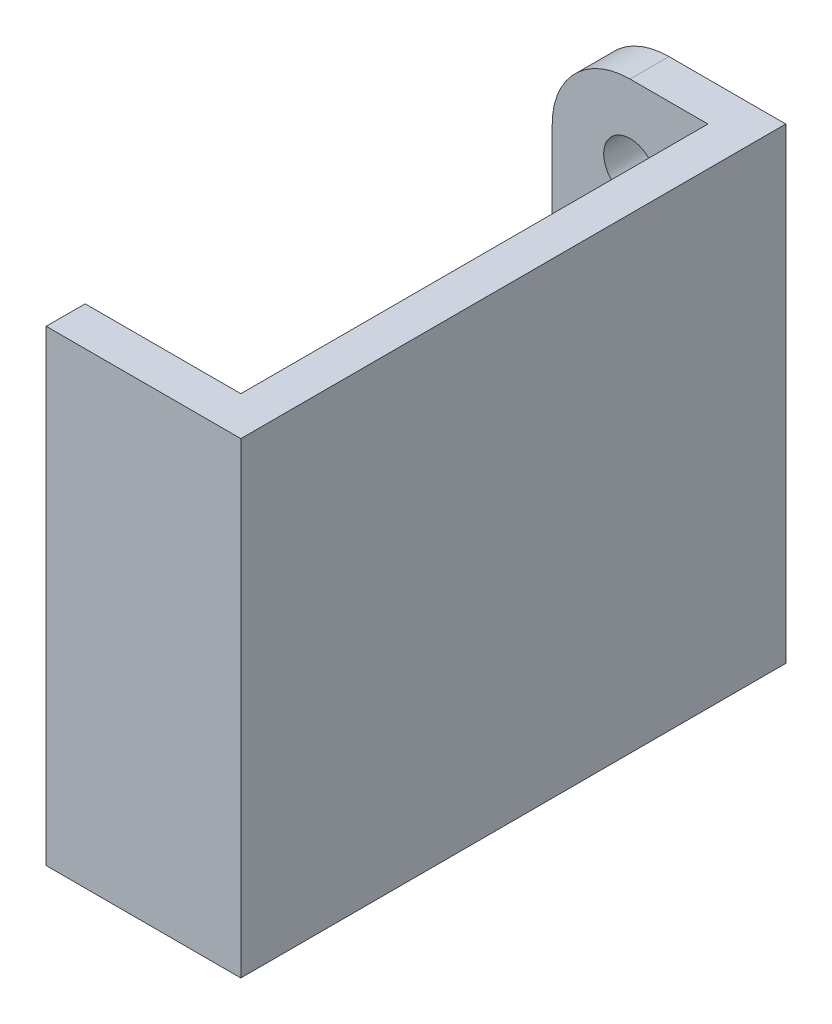
ISO-10303-21;
HEADER;
FILE_DESCRIPTION(('STEP AP214'),'2;1');
FILE_NAME('part.step','',(''),(''),'','','');
FILE_SCHEMA(('AUTOMOTIVE_DESIGN { 1 0 10303 214 1 1 1 1 }'));
ENDSEC;
DATA;
#1=APPLICATION_CONTEXT('core data for automotive mechanical design processes');
#2=APPLICATION_PROTOCOL_DEFINITION('international standard','automotive_design',2000,#1);
#3=PRODUCT_CONTEXT('',#1,'mechanical');
#4=PRODUCT('Part','Part','',(#3));
#5=PRODUCT_RELATED_PRODUCT_CATEGORY('part','',(#4));
#6=PRODUCT_DEFINITION_FORMATION('','',#4);
#7=PRODUCT_DEFINITION_CONTEXT('part definition',#1,'design');
#8=PRODUCT_DEFINITION('design','',#6,#7);
#9=PRODUCT_DEFINITION_SHAPE('','',#8);
#10=(LENGTH_UNIT() NAMED_UNIT(*) SI_UNIT(.MILLI.,.METRE.));
#11=(NAMED_UNIT(*) PLANE_ANGLE_UNIT() SI_UNIT($,.RADIAN.));
#12=(NAMED_UNIT(*) SI_UNIT($,.STERADIAN.) SOLID_ANGLE_UNIT());
#13=UNCERTAINTY_MEASURE_WITH_UNIT(LENGTH_MEASURE(1.E-05),#10,'distance_accuracy_value','');
#14=(GEOMETRIC_REPRESENTATION_CONTEXT(3) GLOBAL_UNCERTAINTY_ASSIGNED_CONTEXT((#13)) GLOBAL_UNIT_ASSIGNED_CONTEXT((#10,
#11,#12)) REPRESENTATION_CONTEXT('',''));
#15=CARTESIAN_POINT('',(0.,0.,0.));
#16=DIRECTION('',(0.,0.,1.));
#17=DIRECTION('',(1.,0.,0.));
#18=AXIS2_PLACEMENT_3D('',#15,#16,#17);
#19=CARTESIAN_POINT('',(-7.9375,19.05,-44.45));
#20=DIRECTION('',(-1.,0.,0.));
#21=DIRECTION('',(0.,-1.,0.));
#22=AXIS2_PLACEMENT_3D('',#19,#20,#21);
#23=PLANE('',#22);
#24=DIRECTION('',(0.,-1.,0.));
#25=VECTOR('',#24,1.);
#26=CARTESIAN_POINT('',(-7.9375,0.,-41.275));
#27=LINE('',#26,#25);
#28=CARTESIAN_POINT('',(-7.9375,12.7,-41.275));
#29=VERTEX_POINT('',#28);
#30=CARTESIAN_POINT('',(-7.9375,-15.875,-41.275));
#31=VERTEX_POINT('',#30);
#32=EDGE_CURVE('E138',#29,#31,#27,.T.);
#33=ORIENTED_EDGE('',*,*,#32,.F.);
#34=DIRECTION('',(0.,0.,1.));
#35=VECTOR('',#34,1.);
#36=CARTESIAN_POINT('',(-7.9375,12.7,-44.45));
#37=LINE('',#36,#35);
#38=CARTESIAN_POINT('',(-7.9375,12.7,-44.45));
#39=VERTEX_POINT('',#38);
#40=EDGE_CURVE('E52',#29,#39,#37,.F.);
#41=ORIENTED_EDGE('',*,*,#40,.T.);
#42=DIRECTION('',(0.,-1.,0.));
#43=VECTOR('',#42,1.);
#44=CARTESIAN_POINT('',(-7.9375,19.05,-44.45));
#45=LINE('',#44,#43);
#46=CARTESIAN_POINT('',(-7.9375,-19.05,-44.45));
#47=VERTEX_POINT('',#46);
#48=EDGE_CURVE('E169',#39,#47,#45,.T.);
#49=ORIENTED_EDGE('',*,*,#48,.T.);
#50=DIRECTION('',(0.,0.,1.));
#51=VECTOR('',#50,1.);
#52=CARTESIAN_POINT('',(-7.9375,-19.05,-44.45));
#53=LINE('',#52,#51);
#54=CARTESIAN_POINT('',(-7.9375,-19.05,0.));
#55=VERTEX_POINT('',#54);
#56=EDGE_CURVE('E195',#47,#55,#53,.T.);
#57=ORIENTED_EDGE('',*,*,#56,.T.);
#58=DIRECTION('',(0.,-1.,0.));
#59=VECTOR('',#58,1.);
#60=CARTESIAN_POINT('',(-7.9375,19.05,0.));
#61=LINE('',#60,#59);
#62=CARTESIAN_POINT('',(-7.9375,19.05,0.));
#63=VERTEX_POINT('',#62);
#64=EDGE_CURVE('E184',#63,#55,#61,.T.);
#65=ORIENTED_EDGE('',*,*,#64,.F.);
#66=DIRECTION('',(0.,0.,1.));
#67=VECTOR('',#66,1.);
#68=CARTESIAN_POINT('',(-7.9375,19.05,-44.45));
#69=LINE('',#68,#67);
#70=CARTESIAN_POINT('',(-7.9375,19.05,-3.175));
#71=VERTEX_POINT('',#70);
#72=EDGE_CURVE('E198',#71,#63,#69,.T.);
#73=ORIENTED_EDGE('',*,*,#72,.F.);
#74=DIRECTION('',(0.,-1.,0.));
#75=VECTOR('',#74,1.);
#76=CARTESIAN_POINT('',(-7.9375,0.,-3.175));
#77=LINE('',#76,#75);
#78=CARTESIAN_POINT('',(-7.9375,-15.875,-3.175));
#79=VERTEX_POINT('',#78);
#80=EDGE_CURVE('E151',#71,#79,#77,.T.);
#81=ORIENTED_EDGE('',*,*,#80,.T.);
#82=DIRECTION('',(0.,0.,1.));
#83=VECTOR('',#82,1.);
#84=CARTESIAN_POINT('',(-7.9375,-15.875,-44.45));
#85=LINE('',#84,#83);
#86=EDGE_CURVE('E126',#31,#79,#85,.T.);
#87=ORIENTED_EDGE('',*,*,#86,.F.);
#88=EDGE_LOOP('',(#33,#41,#49,#57,#65,#73,#81,#87));
#89=FACE_BOUND('',#88,.T.);
#90=ADVANCED_FACE('F43',(#89),#23,.T.);
#91=CARTESIAN_POINT('',(-7.9375,19.05,-44.45));
#92=DIRECTION('',(0.,1.,0.));
#93=DIRECTION('',(0.,0.,1.));
#94=AXIS2_PLACEMENT_3D('',#91,#92,#93);
#95=PLANE('',#94);
#96=DIRECTION('',(-1.,0.,0.));
#97=VECTOR('',#96,1.);
#98=CARTESIAN_POINT('',(-7.9375,19.05,-44.45));
#99=LINE('',#98,#97);
#100=CARTESIAN_POINT('',(7.9375,19.05,-44.45));
#101=VERTEX_POINT('',#100);
#102=CARTESIAN_POINT('',(-1.5875,19.05,-44.45));
#103=VERTEX_POINT('',#102);
#104=EDGE_CURVE('E164',#101,#103,#99,.T.);
#105=ORIENTED_EDGE('',*,*,#104,.T.);
#106=DIRECTION('',(0.,0.,1.));
#107=VECTOR('',#106,1.);
#108=CARTESIAN_POINT('',(-1.5875,19.05,-44.45));
#109=LINE('',#108,#107);
#110=CARTESIAN_POINT('',(-1.5875,19.05,-41.275));
#111=VERTEX_POINT('',#110);
#112=EDGE_CURVE('E194',#103,#111,#109,.T.);
#113=ORIENTED_EDGE('',*,*,#112,.T.);
#114=DIRECTION('',(-1.,0.,0.));
#115=VECTOR('',#114,1.);
#116=CARTESIAN_POINT('',(0.,19.05,-41.275));
#117=LINE('',#116,#115);
#118=CARTESIAN_POINT('',(4.7625,19.05,-41.275));
#119=VERTEX_POINT('',#118);
#120=EDGE_CURVE('E135',#119,#111,#117,.T.);
#121=ORIENTED_EDGE('',*,*,#120,.F.);
#122=DIRECTION('',(0.,0.,1.));
#123=VECTOR('',#122,1.);
#124=CARTESIAN_POINT('',(4.7625,19.05,-44.45));
#125=LINE('',#124,#123);
#126=CARTESIAN_POINT('',(4.7625,19.05,-3.175));
#127=VERTEX_POINT('',#126);
#128=EDGE_CURVE('E132',#119,#127,#125,.T.);
#129=ORIENTED_EDGE('',*,*,#128,.T.);
#130=DIRECTION('',(-1.,0.,0.));
#131=VECTOR('',#130,1.);
#132=CARTESIAN_POINT('',(0.,19.05,-3.175));
#133=LINE('',#132,#131);
#134=EDGE_CURVE('E155',#127,#71,#133,.T.);
#135=ORIENTED_EDGE('',*,*,#134,.T.);
#136=ORIENTED_EDGE('',*,*,#72,.T.);
#137=DIRECTION('',(-1.,0.,0.));
#138=VECTOR('',#137,1.);
#139=CARTESIAN_POINT('',(-7.9375,19.05,0.));
#140=LINE('',#139,#138);
#141=CARTESIAN_POINT('',(7.9375,19.05,0.));
#142=VERTEX_POINT('',#141);
#143=EDGE_CURVE('E180',#142,#63,#140,.T.);
#144=ORIENTED_EDGE('',*,*,#143,.F.);
#145=DIRECTION('',(0.,0.,1.));
#146=VECTOR('',#145,1.);
#147=CARTESIAN_POINT('',(7.9375,19.05,-44.45));
#148=LINE('',#147,#146);
#149=EDGE_CURVE('E176',#101,#142,#148,.T.);
#150=ORIENTED_EDGE('',*,*,#149,.F.);
#151=EDGE_LOOP('',(#105,#113,#121,#129,#135,#136,#144,#150));
#152=FACE_BOUND('',#151,.T.);
#153=ADVANCED_FACE('F210',(#152),#95,.T.);
#154=CARTESIAN_POINT('',(7.9375,19.05,-44.45));
#155=DIRECTION('',(1.,0.,0.));
#156=DIRECTION('',(0.,1.,0.));
#157=AXIS2_PLACEMENT_3D('',#154,#155,#156);
#158=PLANE('',#157);
#159=DIRECTION('',(0.,1.,0.));
#160=VECTOR('',#159,1.);
#161=CARTESIAN_POINT('',(7.9375,19.05,0.));
#162=LINE('',#161,#160);
#163=CARTESIAN_POINT('',(7.9375,-19.05,0.));
#164=VERTEX_POINT('',#163);
#165=EDGE_CURVE('E125',#164,#142,#162,.T.);
#166=ORIENTED_EDGE('',*,*,#165,.F.);
#167=DIRECTION('',(0.,0.,1.));
#168=VECTOR('',#167,1.);
#169=CARTESIAN_POINT('',(7.9375,-19.05,-44.45));
#170=LINE('',#169,#168);
#171=CARTESIAN_POINT('',(7.9375,-19.05,-44.45));
#172=VERTEX_POINT('',#171);
#173=EDGE_CURVE('E191',#172,#164,#170,.T.);
#174=ORIENTED_EDGE('',*,*,#173,.F.);
#175=DIRECTION('',(0.,1.,0.));
#176=VECTOR('',#175,1.);
#177=CARTESIAN_POINT('',(7.9375,19.05,-44.45));
#178=LINE('',#177,#176);
#179=EDGE_CURVE('E160',#172,#101,#178,.T.);
#180=ORIENTED_EDGE('',*,*,#179,.T.);
#181=ORIENTED_EDGE('',*,*,#149,.T.);
#182=EDGE_LOOP('',(#166,#174,#180,#181));
#183=FACE_BOUND('',#182,.T.);
#184=ADVANCED_FACE('F278',(#183),#158,.T.);
#185=CARTESIAN_POINT('',(-7.9375,-19.05,-44.45));
#186=DIRECTION('',(0.,-1.,0.));
#187=DIRECTION('',(0.,0.,-1.));
#188=AXIS2_PLACEMENT_3D('',#185,#186,#187);
#189=PLANE('',#188);
#190=DIRECTION('',(1.,0.,0.));
#191=VECTOR('',#190,1.);
#192=CARTESIAN_POINT('',(-7.9375,-19.05,0.));
#193=LINE('',#192,#191);
#194=EDGE_CURVE('E165',#55,#164,#193,.T.);
#195=ORIENTED_EDGE('',*,*,#194,.F.);
#196=ORIENTED_EDGE('',*,*,#56,.F.);
#197=DIRECTION('',(1.,0.,0.));
#198=VECTOR('',#197,1.);
#199=CARTESIAN_POINT('',(-7.9375,-19.05,-44.45));
#200=LINE('',#199,#198);
#201=EDGE_CURVE('E172',#47,#172,#200,.T.);
#202=ORIENTED_EDGE('',*,*,#201,.T.);
#203=ORIENTED_EDGE('',*,*,#173,.T.);
#204=EDGE_LOOP('',(#195,#196,#202,#203));
#205=FACE_BOUND('',#204,.T.);
#206=ADVANCED_FACE('F222',(#205),#189,.T.);
#207=CARTESIAN_POINT('',(0.,0.,-44.45));
#208=DIRECTION('',(0.,0.,1.));
#209=DIRECTION('',(1.,0.,0.));
#210=AXIS2_PLACEMENT_3D('',#207,#208,#209);
#211=PLANE('',#210);
#212=CARTESIAN_POINT('',(-1.5875,-6.35000000000001,-44.45));
#213=DIRECTION('',(0.,0.,1.));
#214=DIRECTION('',(1.,0.,0.));
#215=AXIS2_PLACEMENT_3D('',#212,#213,#214);
#216=CIRCLE('',#215,2.15265);
#217=CARTESIAN_POINT('',(0.565149999999998,-6.35000000000001,-44.45));
#218=VERTEX_POINT('',#217);
#219=EDGE_CURVE('E231',#218,#218,#216,.F.);
#220=ORIENTED_EDGE('',*,*,#219,.F.);
#221=EDGE_LOOP('',(#220));
#222=FACE_BOUND('',#221,.T.);
#223=CARTESIAN_POINT('',(-1.5875,12.7,-44.45));
#224=DIRECTION('',(0.,0.,1.));
#225=DIRECTION('',(1.,0.,0.));
#226=AXIS2_PLACEMENT_3D('',#223,#224,#225);
#227=CIRCLE('',#226,2.15265);
#228=CARTESIAN_POINT('',(0.565149999999997,12.7,-44.45));
#229=VERTEX_POINT('',#228);
#230=EDGE_CURVE('E242',#229,#229,#227,.F.);
#231=ORIENTED_EDGE('',*,*,#230,.F.);
#232=EDGE_LOOP('',(#231));
#233=FACE_BOUND('',#232,.T.);
#234=ORIENTED_EDGE('',*,*,#48,.F.);
#235=CARTESIAN_POINT('',(-1.5875,12.7,-44.45));
#236=DIRECTION('',(0.,0.,1.));
#237=DIRECTION('',(1.,0.,0.));
#238=AXIS2_PLACEMENT_3D('',#235,#236,#237);
#239=CIRCLE('',#238,6.35);
#240=EDGE_CURVE('E11',#39,#103,#239,.F.);
#241=ORIENTED_EDGE('',*,*,#240,.T.);
#242=ORIENTED_EDGE('',*,*,#104,.F.);
#243=ORIENTED_EDGE('',*,*,#179,.F.);
#244=ORIENTED_EDGE('',*,*,#201,.F.);
#245=EDGE_LOOP('',(#234,#241,#242,#243,#244));
#246=FACE_BOUND('',#245,.T.);
#247=ADVANCED_FACE('F215',(#222,#233,#246),#211,.F.);
#248=CARTESIAN_POINT('',(0.,0.,0.));
#249=DIRECTION('',(0.,0.,1.));
#250=DIRECTION('',(1.,0.,0.));
#251=AXIS2_PLACEMENT_3D('',#248,#249,#250);
#252=PLANE('',#251);
#253=ORIENTED_EDGE('',*,*,#165,.T.);
#254=ORIENTED_EDGE('',*,*,#143,.T.);
#255=ORIENTED_EDGE('',*,*,#64,.T.);
#256=ORIENTED_EDGE('',*,*,#194,.T.);
#257=EDGE_LOOP('',(#253,#254,#255,#256));
#258=FACE_BOUND('',#257,.T.);
#259=ADVANCED_FACE('F225',(#258),#252,.T.);
#260=CARTESIAN_POINT('',(4.7625,19.05,-44.45));
#261=DIRECTION('',(1.,0.,0.));
#262=DIRECTION('',(0.,1.,0.));
#263=AXIS2_PLACEMENT_3D('',#260,#261,#262);
#264=PLANE('',#263);
#265=DIRECTION('',(0.,1.,0.));
#266=VECTOR('',#265,1.);
#267=CARTESIAN_POINT('',(4.7625,0.,-3.175));
#268=LINE('',#267,#266);
#269=CARTESIAN_POINT('',(4.7625,-15.875,-3.175));
#270=VERTEX_POINT('',#269);
#271=EDGE_CURVE('E159',#270,#127,#268,.T.);
#272=ORIENTED_EDGE('',*,*,#271,.T.);
#273=ORIENTED_EDGE('',*,*,#128,.F.);
#274=DIRECTION('',(0.,1.,0.));
#275=VECTOR('',#274,1.);
#276=CARTESIAN_POINT('',(4.7625,0.,-41.275));
#277=LINE('',#276,#275);
#278=CARTESIAN_POINT('',(4.7625,-15.875,-41.275));
#279=VERTEX_POINT('',#278);
#280=EDGE_CURVE('E129',#279,#119,#277,.T.);
#281=ORIENTED_EDGE('',*,*,#280,.F.);
#282=DIRECTION('',(0.,0.,1.));
#283=VECTOR('',#282,1.);
#284=CARTESIAN_POINT('',(4.7625,-15.875,-44.45));
#285=LINE('',#284,#283);
#286=EDGE_CURVE('E113',#279,#270,#285,.T.);
#287=ORIENTED_EDGE('',*,*,#286,.T.);
#288=EDGE_LOOP('',(#272,#273,#281,#287));
#289=FACE_BOUND('',#288,.T.);
#290=ADVANCED_FACE('F130',(#289),#264,.F.);
#291=CARTESIAN_POINT('',(-7.9375,-15.875,-44.45));
#292=DIRECTION('',(0.,-1.,0.));
#293=DIRECTION('',(0.,0.,-1.));
#294=AXIS2_PLACEMENT_3D('',#291,#292,#293);
#295=PLANE('',#294);
#296=DIRECTION('',(1.,0.,0.));
#297=VECTOR('',#296,1.);
#298=CARTESIAN_POINT('',(0.,-15.875,-3.175));
#299=LINE('',#298,#297);
#300=EDGE_CURVE('E120',#79,#270,#299,.T.);
#301=ORIENTED_EDGE('',*,*,#300,.T.);
#302=ORIENTED_EDGE('',*,*,#286,.F.);
#303=DIRECTION('',(1.,0.,0.));
#304=VECTOR('',#303,1.);
#305=CARTESIAN_POINT('',(0.,-15.875,-41.275));
#306=LINE('',#305,#304);
#307=EDGE_CURVE('E117',#31,#279,#306,.T.);
#308=ORIENTED_EDGE('',*,*,#307,.F.);
#309=ORIENTED_EDGE('',*,*,#86,.T.);
#310=EDGE_LOOP('',(#301,#302,#308,#309));
#311=FACE_BOUND('',#310,.T.);
#312=ADVANCED_FACE('F115',(#311),#295,.F.);
#313=CARTESIAN_POINT('',(0.,0.,-41.275));
#314=DIRECTION('',(0.,0.,1.));
#315=DIRECTION('',(1.,0.,0.));
#316=AXIS2_PLACEMENT_3D('',#313,#314,#315);
#317=PLANE('',#316);
#318=CARTESIAN_POINT('',(-1.5875,-6.35000000000001,-41.275));
#319=DIRECTION('',(0.,0.,1.));
#320=DIRECTION('',(1.,0.,0.));
#321=AXIS2_PLACEMENT_3D('',#318,#319,#320);
#322=CIRCLE('',#321,2.15265);
#323=CARTESIAN_POINT('',(0.565149999999998,-6.35000000000001,-41.275));
#324=VERTEX_POINT('',#323);
#325=EDGE_CURVE('E235',#324,#324,#322,.F.);
#326=ORIENTED_EDGE('',*,*,#325,.T.);
#327=EDGE_LOOP('',(#326));
#328=FACE_BOUND('',#327,.T.);
#329=CARTESIAN_POINT('',(-1.5875,12.7,-41.275));
#330=DIRECTION('',(0.,0.,1.));
#331=DIRECTION('',(1.,0.,0.));
#332=AXIS2_PLACEMENT_3D('',#329,#330,#331);
#333=CIRCLE('',#332,2.15265);
#334=CARTESIAN_POINT('',(0.565149999999997,12.7,-41.275));
#335=VERTEX_POINT('',#334);
#336=EDGE_CURVE('E238',#335,#335,#333,.F.);
#337=ORIENTED_EDGE('',*,*,#336,.T.);
#338=EDGE_LOOP('',(#337));
#339=FACE_BOUND('',#338,.T.);
#340=ORIENTED_EDGE('',*,*,#120,.T.);
#341=CARTESIAN_POINT('',(-1.5875,12.7,-41.275));
#342=DIRECTION('',(0.,0.,1.));
#343=DIRECTION('',(1.,0.,0.));
#344=AXIS2_PLACEMENT_3D('',#341,#342,#343);
#345=CIRCLE('',#344,6.35);
#346=EDGE_CURVE('E66',#111,#29,#345,.T.);
#347=ORIENTED_EDGE('',*,*,#346,.T.);
#348=ORIENTED_EDGE('',*,*,#32,.T.);
#349=ORIENTED_EDGE('',*,*,#307,.T.);
#350=ORIENTED_EDGE('',*,*,#280,.T.);
#351=EDGE_LOOP('',(#340,#347,#348,#349,#350));
#352=FACE_BOUND('',#351,.T.);
#353=ADVANCED_FACE('F137',(#328,#339,#352),#317,.T.);
#354=CARTESIAN_POINT('',(0.,0.,-3.175));
#355=DIRECTION('',(0.,0.,1.));
#356=DIRECTION('',(1.,0.,0.));
#357=AXIS2_PLACEMENT_3D('',#354,#355,#356);
#358=PLANE('',#357);
#359=ORIENTED_EDGE('',*,*,#271,.F.);
#360=ORIENTED_EDGE('',*,*,#300,.F.);
#361=ORIENTED_EDGE('',*,*,#80,.F.);
#362=ORIENTED_EDGE('',*,*,#134,.F.);
#363=EDGE_LOOP('',(#359,#360,#361,#362));
#364=FACE_BOUND('',#363,.T.);
#365=ADVANCED_FACE('F229',(#364),#358,.F.);
#366=CARTESIAN_POINT('',(-1.5875,12.7,-44.451));
#367=DIRECTION('',(0.,0.,1.));
#368=DIRECTION('',(1.,0.,0.));
#369=AXIS2_PLACEMENT_3D('',#366,#367,#368);
#370=CYLINDRICAL_SURFACE('',#369,2.15265);
#371=ORIENTED_EDGE('',*,*,#336,.F.);
#372=EDGE_LOOP('',(#371));
#373=FACE_BOUND('',#372,.T.);
#374=ORIENTED_EDGE('',*,*,#230,.T.);
#375=EDGE_LOOP('',(#374));
#376=FACE_BOUND('',#375,.T.);
#377=ADVANCED_FACE('F255',(#373,#376),#370,.F.);
#378=CARTESIAN_POINT('',(-1.5875,-6.35000000000001,-44.451));
#379=DIRECTION('',(0.,0.,1.));
#380=DIRECTION('',(1.,0.,0.));
#381=AXIS2_PLACEMENT_3D('',#378,#379,#380);
#382=CYLINDRICAL_SURFACE('',#381,2.15265);
#383=ORIENTED_EDGE('',*,*,#325,.F.);
#384=EDGE_LOOP('',(#383));
#385=FACE_BOUND('',#384,.T.);
#386=ORIENTED_EDGE('',*,*,#219,.T.);
#387=EDGE_LOOP('',(#386));
#388=FACE_BOUND('',#387,.T.);
#389=ADVANCED_FACE('F252',(#385,#388),#382,.F.);
#390=CARTESIAN_POINT('',(-1.5875,12.7,-44.45));
#391=DIRECTION('',(0.,0.,1.));
#392=DIRECTION('',(1.,0.,0.));
#393=AXIS2_PLACEMENT_3D('',#390,#391,#392);
#394=CYLINDRICAL_SURFACE('',#393,6.35);
#395=ORIENTED_EDGE('',*,*,#240,.F.);
#396=ORIENTED_EDGE('',*,*,#40,.F.);
#397=ORIENTED_EDGE('',*,*,#346,.F.);
#398=ORIENTED_EDGE('',*,*,#112,.F.);
#399=EDGE_LOOP('',(#395,#396,#397,#398));
#400=FACE_BOUND('',#399,.T.);
#401=ADVANCED_FACE('F45',(#400),#394,.T.);
#402=CLOSED_SHELL('',(#90,#153,#184,#206,#247,#259,#290,#312,#353,#365,#377,#389,#401));
#403=MANIFOLD_SOLID_BREP('B2',#402);
#404=ADVANCED_BREP_SHAPE_REPRESENTATION('',(#18,#403),#14);
#405=SHAPE_DEFINITION_REPRESENTATION(#9,#404);
ENDSEC;
END-ISO-10303-21;
